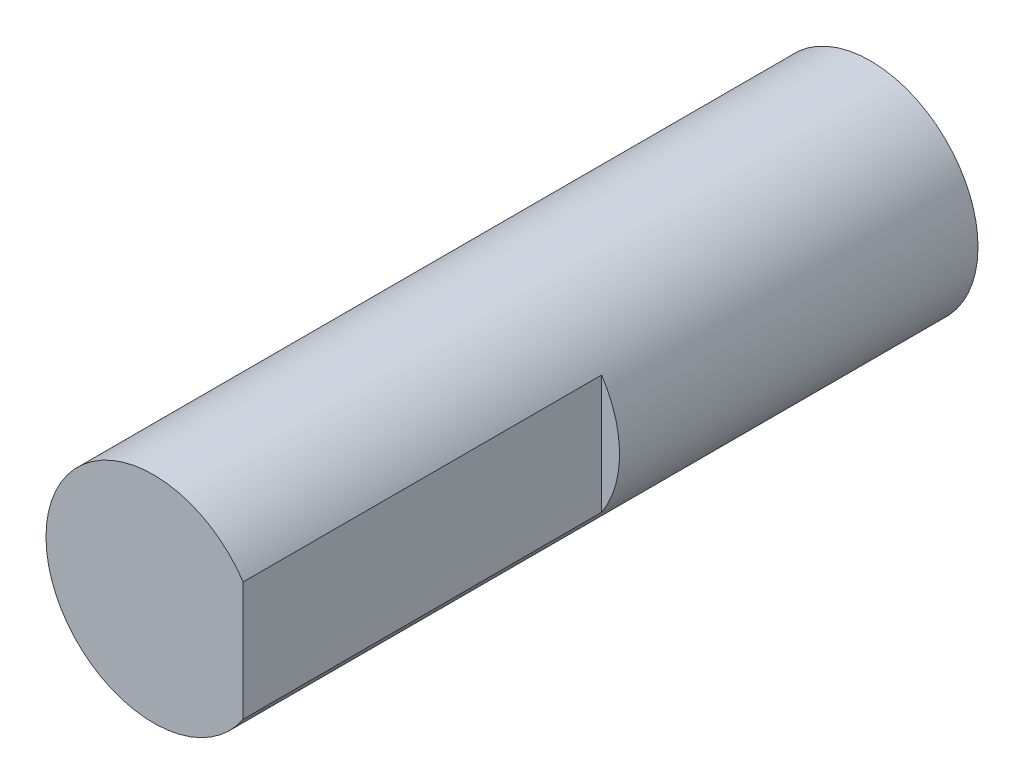
ISO-10303-21;
HEADER;
FILE_DESCRIPTION(('STEP AP214'),'2;1');
FILE_NAME('part.step','',(''),(''),'','','');
FILE_SCHEMA(('AUTOMOTIVE_DESIGN { 1 0 10303 214 1 1 1 1 }'));
ENDSEC;
DATA;
#1=APPLICATION_CONTEXT('core data for automotive mechanical design processes');
#2=APPLICATION_PROTOCOL_DEFINITION('international standard','automotive_design',2000,#1);
#3=PRODUCT_CONTEXT('',#1,'mechanical');
#4=PRODUCT('Part','Part','',(#3));
#5=PRODUCT_RELATED_PRODUCT_CATEGORY('part','',(#4));
#6=PRODUCT_DEFINITION_FORMATION('','',#4);
#7=PRODUCT_DEFINITION_CONTEXT('part definition',#1,'design');
#8=PRODUCT_DEFINITION('design','',#6,#7);
#9=PRODUCT_DEFINITION_SHAPE('','',#8);
#10=(LENGTH_UNIT() NAMED_UNIT(*) SI_UNIT(.MILLI.,.METRE.));
#11=(NAMED_UNIT(*) PLANE_ANGLE_UNIT() SI_UNIT($,.RADIAN.));
#12=(NAMED_UNIT(*) SI_UNIT($,.STERADIAN.) SOLID_ANGLE_UNIT());
#13=UNCERTAINTY_MEASURE_WITH_UNIT(LENGTH_MEASURE(1.E-05),#10,'distance_accuracy_value','');
#14=(GEOMETRIC_REPRESENTATION_CONTEXT(3) GLOBAL_UNCERTAINTY_ASSIGNED_CONTEXT((#13)) GLOBAL_UNIT_ASSIGNED_CONTEXT((#10,
#11,#12)) REPRESENTATION_CONTEXT('',''));
#15=CARTESIAN_POINT('',(0.,0.,0.));
#16=DIRECTION('',(0.,0.,1.));
#17=DIRECTION('',(1.,0.,0.));
#18=AXIS2_PLACEMENT_3D('',#15,#16,#17);
#19=CARTESIAN_POINT('',(-1.38777878078145E-13,0.,20.));
#20=DIRECTION('',(0.,0.,-1.));
#21=DIRECTION('',(-1.,0.,0.));
#22=AXIS2_PLACEMENT_3D('',#19,#20,#21);
#23=CYLINDRICAL_SURFACE('',#22,3.);
#24=CARTESIAN_POINT('',(-1.38777878078145E-13,0.,20.));
#25=DIRECTION('',(0.,0.,1.));
#26=DIRECTION('',(1.,0.,0.));
#27=AXIS2_PLACEMENT_3D('',#24,#25,#26);
#28=CIRCLE('',#27,3.);
#29=CARTESIAN_POINT('',(2.49999999999986,1.65831239517766,20.));
#30=VERTEX_POINT('',#29);
#31=CARTESIAN_POINT('',(2.49999999999981,-1.65831239517766,20.));
#32=VERTEX_POINT('',#31);
#33=EDGE_CURVE('E11',#30,#32,#28,.T.);
#34=ORIENTED_EDGE('',*,*,#33,.F.);
#35=DIRECTION('',(0.,0.,1.));
#36=VECTOR('',#35,1.);
#37=CARTESIAN_POINT('',(2.49999999999989,1.65831239517777,10.));
#38=LINE('',#37,#36);
#39=CARTESIAN_POINT('',(2.49999999999989,1.65831239517777,10.));
#40=VERTEX_POINT('',#39);
#41=EDGE_CURVE('E55',#40,#30,#38,.T.);
#42=ORIENTED_EDGE('',*,*,#41,.F.);
#43=CARTESIAN_POINT('',(-1.38777878078145E-13,0.,10.));
#44=DIRECTION('',(0.,0.,1.));
#45=DIRECTION('',(-1.,0.,0.));
#46=AXIS2_PLACEMENT_3D('',#43,#44,#45);
#47=CIRCLE('',#46,3.);
#48=CARTESIAN_POINT('',(2.49999999999989,-1.65831239517766,10.));
#49=VERTEX_POINT('',#48);
#50=EDGE_CURVE('E70',#49,#40,#47,.T.);
#51=ORIENTED_EDGE('',*,*,#50,.F.);
#52=DIRECTION('',(0.,0.,1.));
#53=VECTOR('',#52,1.);
#54=CARTESIAN_POINT('',(2.49999999999989,-1.65831239517766,10.));
#55=LINE('',#54,#53);
#56=EDGE_CURVE('E61',#49,#32,#55,.T.);
#57=ORIENTED_EDGE('',*,*,#56,.T.);
#58=EDGE_LOOP('',(#34,#42,#51,#57));
#59=FACE_BOUND('',#58,.T.);
#60=CARTESIAN_POINT('',(0.,0.,0.));
#61=DIRECTION('',(0.,0.,1.));
#62=DIRECTION('',(1.,0.,0.));
#63=AXIS2_PLACEMENT_3D('',#60,#61,#62);
#64=CIRCLE('',#63,3.);
#65=CARTESIAN_POINT('',(3.,0.,0.));
#66=VERTEX_POINT('',#65);
#67=EDGE_CURVE('E44',#66,#66,#64,.T.);
#68=ORIENTED_EDGE('',*,*,#67,.T.);
#69=EDGE_LOOP('',(#68));
#70=FACE_BOUND('',#69,.T.);
#71=ADVANCED_FACE('F41',(#59,#70),#23,.T.);
#72=CARTESIAN_POINT('',(-1.38777878078145E-13,0.,20.));
#73=DIRECTION('',(0.,0.,1.));
#74=DIRECTION('',(1.,0.,0.));
#75=AXIS2_PLACEMENT_3D('',#72,#73,#74);
#76=PLANE('',#75);
#77=DIRECTION('',(0.,-1.,0.));
#78=VECTOR('',#77,1.);
#79=CARTESIAN_POINT('',(2.49999999999986,1.65831239517766,20.));
#80=LINE('',#79,#78);
#81=EDGE_CURVE('E66',#30,#32,#80,.T.);
#82=ORIENTED_EDGE('',*,*,#81,.F.);
#83=ORIENTED_EDGE('',*,*,#33,.T.);
#84=EDGE_LOOP('',(#82,#83));
#85=FACE_BOUND('',#84,.T.);
#86=ADVANCED_FACE('F76',(#85),#76,.T.);
#87=CARTESIAN_POINT('',(0.,0.,0.));
#88=DIRECTION('',(0.,0.,1.));
#89=DIRECTION('',(1.,0.,0.));
#90=AXIS2_PLACEMENT_3D('',#87,#88,#89);
#91=PLANE('',#90);
#92=ORIENTED_EDGE('',*,*,#67,.F.);
#93=EDGE_LOOP('',(#92));
#94=FACE_BOUND('',#93,.T.);
#95=ADVANCED_FACE('F78',(#94),#91,.F.);
#96=CARTESIAN_POINT('',(2.49999999999989,1.65831239517777,10.));
#97=DIRECTION('',(-1.,0.,0.));
#98=DIRECTION('',(0.,0.,1.));
#99=AXIS2_PLACEMENT_3D('',#96,#97,#98);
#100=PLANE('',#99);
#101=ORIENTED_EDGE('',*,*,#81,.T.);
#102=ORIENTED_EDGE('',*,*,#56,.F.);
#103=DIRECTION('',(0.,-1.,0.));
#104=VECTOR('',#103,1.);
#105=CARTESIAN_POINT('',(2.49999999999989,1.65831239517777,10.));
#106=LINE('',#105,#104);
#107=EDGE_CURVE('E93',#40,#49,#106,.T.);
#108=ORIENTED_EDGE('',*,*,#107,.F.);
#109=ORIENTED_EDGE('',*,*,#41,.T.);
#110=EDGE_LOOP('',(#101,#102,#108,#109));
#111=FACE_BOUND('',#110,.T.);
#112=ADVANCED_FACE('F67',(#111),#100,.F.);
#113=CARTESIAN_POINT('',(-1.38777878078145E-13,0.,10.));
#114=DIRECTION('',(0.,0.,-1.));
#115=DIRECTION('',(-1.,0.,0.));
#116=AXIS2_PLACEMENT_3D('',#113,#114,#115);
#117=PLANE('',#116);
#118=ORIENTED_EDGE('',*,*,#50,.T.);
#119=ORIENTED_EDGE('',*,*,#107,.T.);
#120=EDGE_LOOP('',(#118,#119));
#121=FACE_BOUND('',#120,.T.);
#122=ADVANCED_FACE('F88',(#121),#117,.F.);
#123=CLOSED_SHELL('',(#71,#86,#95,#112,#122));
#124=MANIFOLD_SOLID_BREP('B2',#123);
#125=ADVANCED_BREP_SHAPE_REPRESENTATION('',(#18,#124),#14);
#126=SHAPE_DEFINITION_REPRESENTATION(#9,#125);
ENDSEC;
END-ISO-10303-21;
